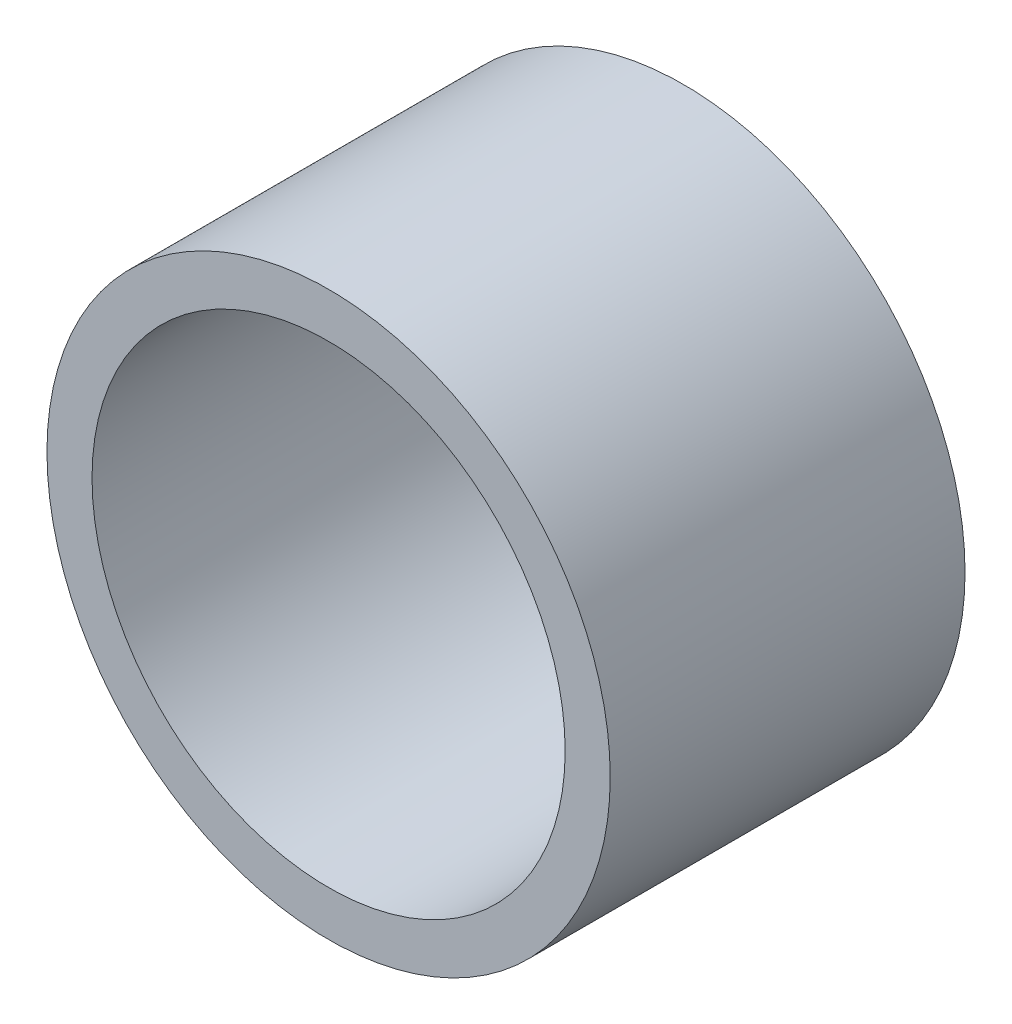
ISO-10303-21;
HEADER;
FILE_DESCRIPTION(('STEP AP214'),'2;1');
FILE_NAME('part.step','',(''),(''),'','','');
FILE_SCHEMA(('AUTOMOTIVE_DESIGN { 1 0 10303 214 1 1 1 1 }'));
ENDSEC;
DATA;
#1=APPLICATION_CONTEXT('core data for automotive mechanical design processes');
#2=APPLICATION_PROTOCOL_DEFINITION('international standard','automotive_design',2000,#1);
#3=PRODUCT_CONTEXT('',#1,'mechanical');
#4=PRODUCT('Part','Part','',(#3));
#5=PRODUCT_RELATED_PRODUCT_CATEGORY('part','',(#4));
#6=PRODUCT_DEFINITION_FORMATION('','',#4);
#7=PRODUCT_DEFINITION_CONTEXT('part definition',#1,'design');
#8=PRODUCT_DEFINITION('design','',#6,#7);
#9=PRODUCT_DEFINITION_SHAPE('','',#8);
#10=(LENGTH_UNIT() NAMED_UNIT(*) SI_UNIT(.MILLI.,.METRE.));
#11=(NAMED_UNIT(*) PLANE_ANGLE_UNIT() SI_UNIT($,.RADIAN.));
#12=(NAMED_UNIT(*) SI_UNIT($,.STERADIAN.) SOLID_ANGLE_UNIT());
#13=UNCERTAINTY_MEASURE_WITH_UNIT(LENGTH_MEASURE(1.E-05),#10,'distance_accuracy_value','');
#14=(GEOMETRIC_REPRESENTATION_CONTEXT(3) GLOBAL_UNCERTAINTY_ASSIGNED_CONTEXT((#13)) GLOBAL_UNIT_ASSIGNED_CONTEXT((#10,
#11,#12)) REPRESENTATION_CONTEXT('',''));
#15=CARTESIAN_POINT('',(0.,0.,0.));
#16=DIRECTION('',(0.,0.,1.));
#17=DIRECTION('',(1.,0.,0.));
#18=AXIS2_PLACEMENT_3D('',#15,#16,#17);
#19=CARTESIAN_POINT('',(0.,0.,4.));
#20=DIRECTION('',(0.,0.,1.));
#21=DIRECTION('',(1.,0.,0.));
#22=AXIS2_PLACEMENT_3D('',#19,#20,#21);
#23=PLANE('',#22);
#24=CARTESIAN_POINT('',(0.,0.,4.));
#25=DIRECTION('',(0.,0.,1.));
#26=DIRECTION('',(1.,0.,0.));
#27=AXIS2_PLACEMENT_3D('',#24,#25,#26);
#28=CIRCLE('',#27,3.175);
#29=CARTESIAN_POINT('',(3.175,0.,4.));
#30=VERTEX_POINT('',#29);
#31=EDGE_CURVE('E10',#30,#30,#28,.T.);
#32=ORIENTED_EDGE('',*,*,#31,.T.);
#33=EDGE_LOOP('',(#32));
#34=FACE_BOUND('',#33,.T.);
#35=CARTESIAN_POINT('',(0.,0.,4.));
#36=DIRECTION('',(0.,0.,1.));
#37=DIRECTION('',(1.,0.,0.));
#38=AXIS2_PLACEMENT_3D('',#35,#36,#37);
#39=CIRCLE('',#38,2.667);
#40=CARTESIAN_POINT('',(2.667,0.,4.));
#41=VERTEX_POINT('',#40);
#42=EDGE_CURVE('E50',#41,#41,#39,.T.);
#43=ORIENTED_EDGE('',*,*,#42,.F.);
#44=EDGE_LOOP('',(#43));
#45=FACE_BOUND('',#44,.T.);
#46=ADVANCED_FACE('F37',(#34,#45),#23,.T.);
#47=CARTESIAN_POINT('',(0.,0.,0.));
#48=DIRECTION('',(0.,0.,1.));
#49=DIRECTION('',(1.,0.,0.));
#50=AXIS2_PLACEMENT_3D('',#47,#48,#49);
#51=PLANE('',#50);
#52=CARTESIAN_POINT('',(0.,0.,0.));
#53=DIRECTION('',(0.,0.,1.));
#54=DIRECTION('',(1.,0.,0.));
#55=AXIS2_PLACEMENT_3D('',#52,#53,#54);
#56=CIRCLE('',#55,3.175);
#57=CARTESIAN_POINT('',(3.175,0.,0.));
#58=VERTEX_POINT('',#57);
#59=EDGE_CURVE('E41',#58,#58,#56,.T.);
#60=ORIENTED_EDGE('',*,*,#59,.F.);
#61=EDGE_LOOP('',(#60));
#62=FACE_BOUND('',#61,.T.);
#63=CARTESIAN_POINT('',(0.,0.,0.));
#64=DIRECTION('',(0.,0.,1.));
#65=DIRECTION('',(1.,0.,0.));
#66=AXIS2_PLACEMENT_3D('',#63,#64,#65);
#67=CIRCLE('',#66,2.667);
#68=CARTESIAN_POINT('',(2.667,0.,0.));
#69=VERTEX_POINT('',#68);
#70=EDGE_CURVE('E52',#69,#69,#67,.T.);
#71=ORIENTED_EDGE('',*,*,#70,.T.);
#72=EDGE_LOOP('',(#71));
#73=FACE_BOUND('',#72,.T.);
#74=ADVANCED_FACE('F64',(#62,#73),#51,.F.);
#75=CARTESIAN_POINT('',(0.,0.,4.));
#76=DIRECTION('',(0.,0.,-1.));
#77=DIRECTION('',(-1.,0.,0.));
#78=AXIS2_PLACEMENT_3D('',#75,#76,#77);
#79=CYLINDRICAL_SURFACE('',#78,3.175);
#80=ORIENTED_EDGE('',*,*,#31,.F.);
#81=EDGE_LOOP('',(#80));
#82=FACE_BOUND('',#81,.T.);
#83=ORIENTED_EDGE('',*,*,#59,.T.);
#84=EDGE_LOOP('',(#83));
#85=FACE_BOUND('',#84,.T.);
#86=ADVANCED_FACE('F39',(#82,#85),#79,.T.);
#87=CARTESIAN_POINT('',(0.,0.,4.));
#88=DIRECTION('',(0.,0.,-1.));
#89=DIRECTION('',(-1.,0.,0.));
#90=AXIS2_PLACEMENT_3D('',#87,#88,#89);
#91=CYLINDRICAL_SURFACE('',#90,2.667);
#92=ORIENTED_EDGE('',*,*,#42,.T.);
#93=EDGE_LOOP('',(#92));
#94=FACE_BOUND('',#93,.T.);
#95=ORIENTED_EDGE('',*,*,#70,.F.);
#96=EDGE_LOOP('',(#95));
#97=FACE_BOUND('',#96,.T.);
#98=ADVANCED_FACE('F60',(#94,#97),#91,.F.);
#99=CLOSED_SHELL('',(#46,#74,#86,#98));
#100=MANIFOLD_SOLID_BREP('B2',#99);
#101=ADVANCED_BREP_SHAPE_REPRESENTATION('',(#18,#100),#14);
#102=SHAPE_DEFINITION_REPRESENTATION(#9,#101);
ENDSEC;
END-ISO-10303-21;
